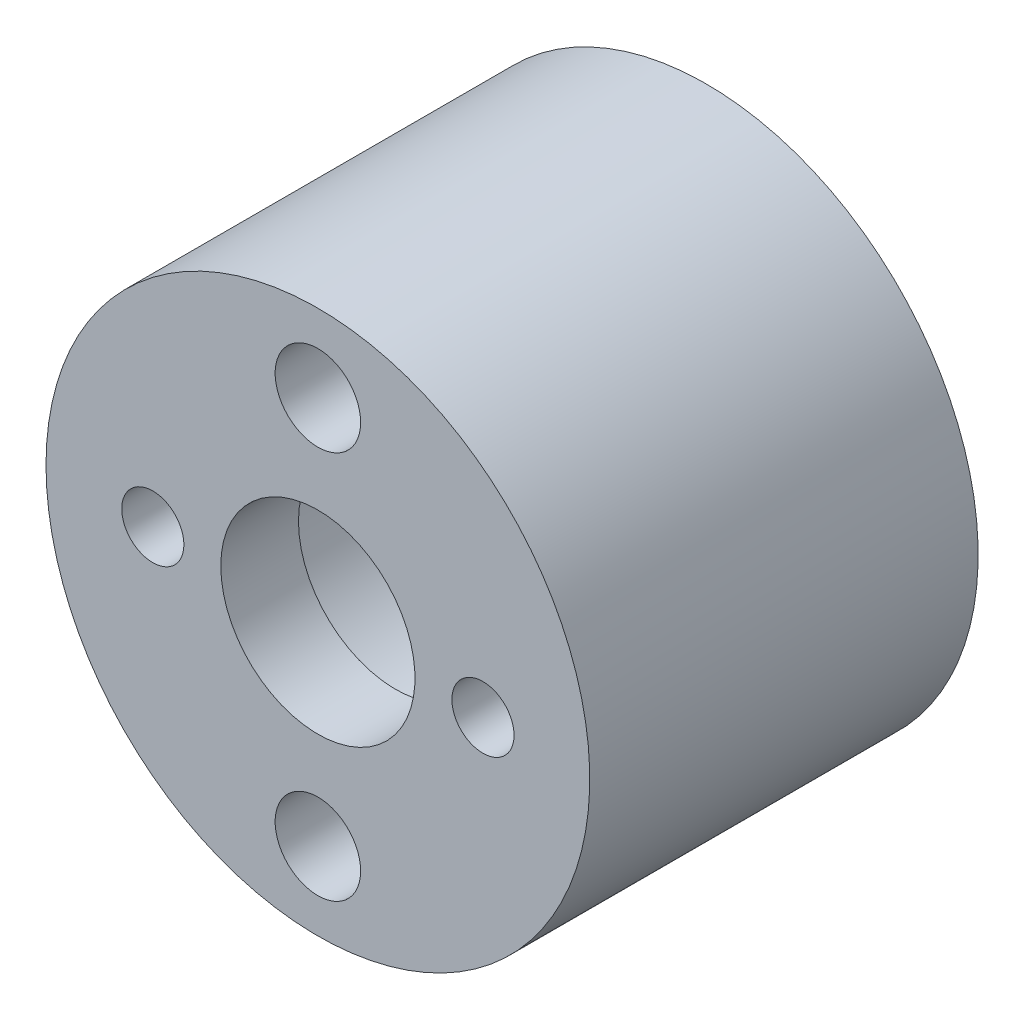
ISO-10303-21;
HEADER;
FILE_DESCRIPTION(('STEP AP214'),'2;1');
FILE_NAME('part.step','',(''),(''),'','','');
FILE_SCHEMA(('AUTOMOTIVE_DESIGN { 1 0 10303 214 1 1 1 1 }'));
ENDSEC;
DATA;
#1=APPLICATION_CONTEXT('core data for automotive mechanical design processes');
#2=APPLICATION_PROTOCOL_DEFINITION('international standard','automotive_design',2000,#1);
#3=PRODUCT_CONTEXT('',#1,'mechanical');
#4=PRODUCT('Part','Part','',(#3));
#5=PRODUCT_RELATED_PRODUCT_CATEGORY('part','',(#4));
#6=PRODUCT_DEFINITION_FORMATION('','',#4);
#7=PRODUCT_DEFINITION_CONTEXT('part definition',#1,'design');
#8=PRODUCT_DEFINITION('design','',#6,#7);
#9=PRODUCT_DEFINITION_SHAPE('','',#8);
#10=(LENGTH_UNIT() NAMED_UNIT(*) SI_UNIT(.MILLI.,.METRE.));
#11=(NAMED_UNIT(*) PLANE_ANGLE_UNIT() SI_UNIT($,.RADIAN.));
#12=(NAMED_UNIT(*) SI_UNIT($,.STERADIAN.) SOLID_ANGLE_UNIT());
#13=UNCERTAINTY_MEASURE_WITH_UNIT(LENGTH_MEASURE(1.E-05),#10,'distance_accuracy_value','');
#14=(GEOMETRIC_REPRESENTATION_CONTEXT(3) GLOBAL_UNCERTAINTY_ASSIGNED_CONTEXT((#13)) GLOBAL_UNIT_ASSIGNED_CONTEXT((#10,
#11,#12)) REPRESENTATION_CONTEXT('',''));
#15=CARTESIAN_POINT('',(0.,0.,0.));
#16=DIRECTION('',(0.,0.,1.));
#17=DIRECTION('',(1.,0.,0.));
#18=AXIS2_PLACEMENT_3D('',#15,#16,#17);
#19=CARTESIAN_POINT('',(0.,0.,0.));
#20=DIRECTION('',(0.,0.,-1.));
#21=DIRECTION('',(-1.,0.,0.));
#22=AXIS2_PLACEMENT_3D('',#19,#20,#21);
#23=PLANE('',#22);
#24=CARTESIAN_POINT('',(-4.25,0.,0.));
#25=DIRECTION('',(0.,0.,1.));
#26=DIRECTION('',(1.,0.,0.));
#27=AXIS2_PLACEMENT_3D('',#24,#25,#26);
#28=CIRCLE('',#27,0.8);
#29=CARTESIAN_POINT('',(-3.45,0.,0.));
#30=VERTEX_POINT('',#29);
#31=EDGE_CURVE('E74',#30,#30,#28,.T.);
#32=ORIENTED_EDGE('',*,*,#31,.F.);
#33=EDGE_LOOP('',(#32));
#34=FACE_BOUND('',#33,.T.);
#35=CARTESIAN_POINT('',(4.25,0.,0.));
#36=DIRECTION('',(0.,0.,1.));
#37=DIRECTION('',(1.,0.,0.));
#38=AXIS2_PLACEMENT_3D('',#35,#36,#37);
#39=CIRCLE('',#38,0.800000000000001);
#40=CARTESIAN_POINT('',(5.05,0.,0.));
#41=VERTEX_POINT('',#40);
#42=EDGE_CURVE('E73',#41,#41,#39,.T.);
#43=ORIENTED_EDGE('',*,*,#42,.F.);
#44=EDGE_LOOP('',(#43));
#45=FACE_BOUND('',#44,.T.);
#46=CARTESIAN_POINT('',(0.,-5.,0.));
#47=DIRECTION('',(0.,0.,1.));
#48=DIRECTION('',(1.,0.,0.));
#49=AXIS2_PLACEMENT_3D('',#46,#47,#48);
#50=CIRCLE('',#49,1.1);
#51=CARTESIAN_POINT('',(1.1,-5.,0.));
#52=VERTEX_POINT('',#51);
#53=EDGE_CURVE('E242',#52,#52,#50,.T.);
#54=ORIENTED_EDGE('',*,*,#53,.F.);
#55=EDGE_LOOP('',(#54));
#56=FACE_BOUND('',#55,.T.);
#57=CARTESIAN_POINT('',(0.,5.,0.));
#58=DIRECTION('',(0.,0.,1.));
#59=DIRECTION('',(1.,0.,0.));
#60=AXIS2_PLACEMENT_3D('',#57,#58,#59);
#61=CIRCLE('',#60,1.1);
#62=CARTESIAN_POINT('',(1.1,5.,0.));
#63=VERTEX_POINT('',#62);
#64=EDGE_CURVE('E250',#63,#63,#61,.T.);
#65=ORIENTED_EDGE('',*,*,#64,.F.);
#66=EDGE_LOOP('',(#65));
#67=FACE_BOUND('',#66,.T.);
#68=CARTESIAN_POINT('',(0.,0.,0.));
#69=DIRECTION('',(0.,0.,-1.));
#70=DIRECTION('',(-1.,0.,0.));
#71=AXIS2_PLACEMENT_3D('',#68,#69,#70);
#72=CIRCLE('',#71,2.5);
#73=CARTESIAN_POINT('',(-2.5,0.,0.));
#74=VERTEX_POINT('',#73);
#75=EDGE_CURVE('E255',#74,#74,#72,.T.);
#76=ORIENTED_EDGE('',*,*,#75,.T.);
#77=EDGE_LOOP('',(#76));
#78=FACE_BOUND('',#77,.T.);
#79=CARTESIAN_POINT('',(0.,0.,0.));
#80=DIRECTION('',(0.,0.,-1.));
#81=DIRECTION('',(-1.,0.,0.));
#82=AXIS2_PLACEMENT_3D('',#79,#80,#81);
#83=CIRCLE('',#82,7.);
#84=CARTESIAN_POINT('',(-7.,0.,0.));
#85=VERTEX_POINT('',#84);
#86=EDGE_CURVE('E67',#85,#85,#83,.T.);
#87=ORIENTED_EDGE('',*,*,#86,.F.);
#88=EDGE_LOOP('',(#87));
#89=FACE_BOUND('',#88,.T.);
#90=ADVANCED_FACE('F33',(#34,#45,#56,#67,#78,#89),#23,.F.);
#91=CARTESIAN_POINT('',(0.,0.,-2.));
#92=DIRECTION('',(0.,0.,-1.));
#93=DIRECTION('',(-1.,0.,0.));
#94=AXIS2_PLACEMENT_3D('',#91,#92,#93);
#95=CYLINDRICAL_SURFACE('',#94,7.);
#96=CARTESIAN_POINT('',(0.,0.,-10.));
#97=DIRECTION('',(0.,0.,-1.));
#98=DIRECTION('',(-1.,0.,0.));
#99=AXIS2_PLACEMENT_3D('',#96,#97,#98);
#100=CIRCLE('',#99,7.);
#101=CARTESIAN_POINT('',(-7.,0.,-10.));
#102=VERTEX_POINT('',#101);
#103=EDGE_CURVE('E87',#102,#102,#100,.T.);
#104=ORIENTED_EDGE('',*,*,#103,.F.);
#105=EDGE_LOOP('',(#104));
#106=FACE_BOUND('',#105,.T.);
#107=ORIENTED_EDGE('',*,*,#86,.T.);
#108=EDGE_LOOP('',(#107));
#109=FACE_BOUND('',#108,.T.);
#110=ADVANCED_FACE('F107',(#106,#109),#95,.T.);
#111=CARTESIAN_POINT('',(7.,0.,-10.));
#112=DIRECTION('',(0.,0.,1.));
#113=DIRECTION('',(1.,0.,0.));
#114=AXIS2_PLACEMENT_3D('',#111,#112,#113);
#115=PLANE('',#114);
#116=CARTESIAN_POINT('',(0.,0.,-10.));
#117=DIRECTION('',(0.,0.,1.));
#118=DIRECTION('',(1.,0.,0.));
#119=AXIS2_PLACEMENT_3D('',#116,#117,#118);
#120=CIRCLE('',#119,3.80000000000001);
#121=CARTESIAN_POINT('',(3.80000000000001,0.,-10.));
#122=VERTEX_POINT('',#121);
#123=EDGE_CURVE('E11',#122,#122,#120,.T.);
#124=ORIENTED_EDGE('',*,*,#123,.T.);
#125=EDGE_LOOP('',(#124));
#126=FACE_BOUND('',#125,.T.);
#127=ORIENTED_EDGE('',*,*,#103,.T.);
#128=EDGE_LOOP('',(#127));
#129=FACE_BOUND('',#128,.T.);
#130=ADVANCED_FACE('F112',(#126,#129),#115,.F.);
#131=CARTESIAN_POINT('',(0.,0.,-2.));
#132=DIRECTION('',(0.,0.,-1.));
#133=DIRECTION('',(-1.,0.,0.));
#134=AXIS2_PLACEMENT_3D('',#131,#132,#133);
#135=CYLINDRICAL_SURFACE('',#134,3.5);
#136=CARTESIAN_POINT('',(0.,0.,-9.7));
#137=DIRECTION('',(0.,0.,1.));
#138=DIRECTION('',(1.,0.,0.));
#139=AXIS2_PLACEMENT_3D('',#136,#137,#138);
#140=CIRCLE('',#139,3.5);
#141=CARTESIAN_POINT('',(3.5,0.,-9.7));
#142=VERTEX_POINT('',#141);
#143=EDGE_CURVE('E41',#142,#142,#140,.F.);
#144=ORIENTED_EDGE('',*,*,#143,.T.);
#145=EDGE_LOOP('',(#144));
#146=FACE_BOUND('',#145,.T.);
#147=CARTESIAN_POINT('',(0.,0.,-2.));
#148=DIRECTION('',(0.,0.,-1.));
#149=DIRECTION('',(-1.,0.,0.));
#150=AXIS2_PLACEMENT_3D('',#147,#148,#149);
#151=CIRCLE('',#150,3.5);
#152=CARTESIAN_POINT('',(3.49088235294118,0.25246860779883,-2.));
#153=VERTEX_POINT('',#152);
#154=CARTESIAN_POINT('',(3.49088235294118,-0.252468607798831,-2.));
#155=VERTEX_POINT('',#154);
#156=EDGE_CURVE('E86',#153,#155,#151,.T.);
#157=ORIENTED_EDGE('',*,*,#156,.F.);
#158=CARTESIAN_POINT('',(-3.49088235294118,0.252468607798824,-2.));
#159=VERTEX_POINT('',#158);
#160=EDGE_CURVE('E81',#159,#153,#151,.T.);
#161=ORIENTED_EDGE('',*,*,#160,.F.);
#162=CARTESIAN_POINT('',(-3.49088235294118,-0.252468607798824,-2.));
#163=VERTEX_POINT('',#162);
#164=EDGE_CURVE('E72',#163,#159,#151,.T.);
#165=ORIENTED_EDGE('',*,*,#164,.F.);
#166=EDGE_CURVE('E80',#155,#163,#151,.T.);
#167=ORIENTED_EDGE('',*,*,#166,.F.);
#168=EDGE_LOOP('',(#157,#161,#165,#167));
#169=FACE_BOUND('',#168,.T.);
#170=ADVANCED_FACE('F79',(#146,#169),#135,.F.);
#171=CARTESIAN_POINT('',(3.5,0.,-2.));
#172=DIRECTION('',(0.,0.,1.));
#173=DIRECTION('',(1.,0.,0.));
#174=AXIS2_PLACEMENT_3D('',#171,#172,#173);
#175=PLANE('',#174);
#176=CARTESIAN_POINT('',(0.,0.,-2.));
#177=DIRECTION('',(0.,0.,-1.));
#178=DIRECTION('',(-1.,0.,0.));
#179=AXIS2_PLACEMENT_3D('',#176,#177,#178);
#180=CIRCLE('',#179,2.5);
#181=CARTESIAN_POINT('',(-2.5,0.,-2.));
#182=VERTEX_POINT('',#181);
#183=EDGE_CURVE('E90',#182,#182,#180,.T.);
#184=ORIENTED_EDGE('',*,*,#183,.F.);
#185=EDGE_LOOP('',(#184));
#186=FACE_BOUND('',#185,.T.);
#187=ORIENTED_EDGE('',*,*,#166,.T.);
#188=CARTESIAN_POINT('',(-4.25,0.,-2.));
#189=DIRECTION('',(0.,0.,1.));
#190=DIRECTION('',(1.,0.,0.));
#191=AXIS2_PLACEMENT_3D('',#188,#189,#190);
#192=CIRCLE('',#191,0.8);
#193=EDGE_CURVE('E61',#163,#159,#192,.T.);
#194=ORIENTED_EDGE('',*,*,#193,.T.);
#195=ORIENTED_EDGE('',*,*,#160,.T.);
#196=CARTESIAN_POINT('',(4.25,0.,-2.));
#197=DIRECTION('',(0.,0.,1.));
#198=DIRECTION('',(1.,0.,0.));
#199=AXIS2_PLACEMENT_3D('',#196,#197,#198);
#200=CIRCLE('',#199,0.800000000000001);
#201=EDGE_CURVE('E85',#155,#153,#200,.F.);
#202=ORIENTED_EDGE('',*,*,#201,.F.);
#203=EDGE_LOOP('',(#187,#194,#195,#202));
#204=FACE_BOUND('',#203,.T.);
#205=ADVANCED_FACE('F84',(#186,#204),#175,.F.);
#206=CARTESIAN_POINT('',(0.,0.,0.));
#207=DIRECTION('',(0.,0.,-1.));
#208=DIRECTION('',(-1.,0.,0.));
#209=AXIS2_PLACEMENT_3D('',#206,#207,#208);
#210=CYLINDRICAL_SURFACE('',#209,2.5);
#211=ORIENTED_EDGE('',*,*,#75,.F.);
#212=EDGE_LOOP('',(#211));
#213=FACE_BOUND('',#212,.T.);
#214=ORIENTED_EDGE('',*,*,#183,.T.);
#215=EDGE_LOOP('',(#214));
#216=FACE_BOUND('',#215,.T.);
#217=ADVANCED_FACE('F125',(#213,#216),#210,.F.);
#218=CARTESIAN_POINT('',(0.,5.,-5.11126983722081));
#219=DIRECTION('',(0.,0.,1.));
#220=DIRECTION('',(1.,0.,0.));
#221=AXIS2_PLACEMENT_3D('',#218,#219,#220);
#222=CYLINDRICAL_SURFACE('',#221,1.1);
#223=CARTESIAN_POINT('',(0.,5.,-2.));
#224=DIRECTION('',(0.,0.,1.));
#225=DIRECTION('',(1.,0.,0.));
#226=AXIS2_PLACEMENT_3D('',#223,#224,#225);
#227=CIRCLE('',#226,1.1);
#228=CARTESIAN_POINT('',(1.1,5.,-2.));
#229=VERTEX_POINT('',#228);
#230=EDGE_CURVE('E253',#229,#229,#227,.F.);
#231=CARTESIAN_POINT('',(1.1,5.,-2.));
#232=CARTESIAN_POINT('',(1.1,5.,-1.97916666666667));
#233=CARTESIAN_POINT('',(1.1,5.,-1.95833333333333));
#234=CARTESIAN_POINT('',(1.1,5.,-1.91666666666667));
#235=CARTESIAN_POINT('',(1.1,5.,-1.89583333333333));
#236=CARTESIAN_POINT('',(1.1,5.,-1.85416666666667));
#237=CARTESIAN_POINT('',(1.1,5.,-1.83333333333333));
#238=CARTESIAN_POINT('',(1.1,5.,-1.79166666666667));
#239=CARTESIAN_POINT('',(1.1,5.,-1.77083333333333));
#240=CARTESIAN_POINT('',(1.1,5.,-1.72916666666667));
#241=CARTESIAN_POINT('',(1.1,5.,-1.70833333333333));
#242=CARTESIAN_POINT('',(1.1,5.,-1.66666666666667));
#243=CARTESIAN_POINT('',(1.1,5.,-1.64583333333333));
#244=CARTESIAN_POINT('',(1.1,5.,-1.60416666666667));
#245=CARTESIAN_POINT('',(1.1,5.,-1.58333333333333));
#246=CARTESIAN_POINT('',(1.1,5.,-1.54166666666667));
#247=CARTESIAN_POINT('',(1.1,5.,-1.52083333333333));
#248=CARTESIAN_POINT('',(1.1,5.,-1.47916666666667));
#249=CARTESIAN_POINT('',(1.1,5.,-1.45833333333333));
#250=CARTESIAN_POINT('',(1.1,5.,-1.41666666666667));
#251=CARTESIAN_POINT('',(1.1,5.,-1.39583333333333));
#252=CARTESIAN_POINT('',(1.1,5.,-1.35416666666667));
#253=CARTESIAN_POINT('',(1.1,5.,-1.33333333333333));
#254=CARTESIAN_POINT('',(1.1,5.,-1.29166666666667));
#255=CARTESIAN_POINT('',(1.1,5.,-1.27083333333333));
#256=CARTESIAN_POINT('',(1.1,5.,-1.22916666666667));
#257=CARTESIAN_POINT('',(1.1,5.,-1.20833333333333));
#258=CARTESIAN_POINT('',(1.1,5.,-1.16666666666667));
#259=CARTESIAN_POINT('',(1.1,5.,-1.14583333333333));
#260=CARTESIAN_POINT('',(1.1,5.,-1.10416666666667));
#261=CARTESIAN_POINT('',(1.1,5.,-1.08333333333333));
#262=CARTESIAN_POINT('',(1.1,5.,-1.04166666666667));
#263=CARTESIAN_POINT('',(1.1,5.,-1.02083333333333));
#264=CARTESIAN_POINT('',(1.1,5.,-0.979166666666668));
#265=CARTESIAN_POINT('',(1.1,5.,-0.958333333333334));
#266=CARTESIAN_POINT('',(1.1,5.,-0.916666666666668));
#267=CARTESIAN_POINT('',(1.1,5.,-0.895833333333334));
#268=CARTESIAN_POINT('',(1.1,5.,-0.854166666666667));
#269=CARTESIAN_POINT('',(1.1,5.,-0.833333333333334));
#270=CARTESIAN_POINT('',(1.1,5.,-0.791666666666667));
#271=CARTESIAN_POINT('',(1.1,5.,-0.770833333333334));
#272=CARTESIAN_POINT('',(1.1,5.,-0.729166666666667));
#273=CARTESIAN_POINT('',(1.1,5.,-0.708333333333334));
#274=CARTESIAN_POINT('',(1.1,5.,-0.666666666666668));
#275=CARTESIAN_POINT('',(1.1,5.,-0.645833333333334));
#276=CARTESIAN_POINT('',(1.1,5.,-0.604166666666668));
#277=CARTESIAN_POINT('',(1.1,5.,-0.583333333333335));
#278=CARTESIAN_POINT('',(1.1,5.,-0.541666666666668));
#279=CARTESIAN_POINT('',(1.1,5.,-0.520833333333335));
#280=CARTESIAN_POINT('',(1.1,5.,-0.479166666666668));
#281=CARTESIAN_POINT('',(1.1,5.,-0.458333333333335));
#282=CARTESIAN_POINT('',(1.1,5.,-0.416666666666668));
#283=CARTESIAN_POINT('',(1.1,5.,-0.395833333333335));
#284=CARTESIAN_POINT('',(1.1,5.,-0.354166666666668));
#285=CARTESIAN_POINT('',(1.1,5.,-0.333333333333335));
#286=CARTESIAN_POINT('',(1.1,5.,-0.291666666666668));
#287=CARTESIAN_POINT('',(1.1,5.,-0.270833333333334));
#288=CARTESIAN_POINT('',(1.1,5.,-0.229166666666668));
#289=CARTESIAN_POINT('',(1.1,5.,-0.208333333333334));
#290=CARTESIAN_POINT('',(1.1,5.,-0.166666666666668));
#291=CARTESIAN_POINT('',(1.1,5.,-0.145833333333334));
#292=CARTESIAN_POINT('',(1.1,5.,-0.104166666666668));
#293=CARTESIAN_POINT('',(1.1,5.,-0.0833333333333343));
#294=CARTESIAN_POINT('',(1.1,5.,-0.0416666666666676));
#295=CARTESIAN_POINT('',(1.1,5.,-0.0208333333333342));
#296=CARTESIAN_POINT('',(1.1,5.,0.));
#297=B_SPLINE_CURVE_WITH_KNOTS('',3,(#231,#232,#233,#234,#235,#236,#237,#238,#239,#240,#241,
#242,#243,#244,#245,#246,#247,#248,#249,#250,#251,#252,#253,#254,#255,#256,#257,#258,#259,#260,
#261,#262,#263,#264,#265,#266,#267,#268,#269,#270,#271,#272,#273,#274,#275,#276,#277,#278,#279,
#280,#281,#282,#283,#284,#285,#286,#287,#288,#289,#290,#291,#292,#293,#294,#295,#296),
.UNSPECIFIED.,.F.,.F.,(4,2,2,2,2,2,2,2,2,2,2,2,2,2,2,2,2,2,2,2,2,2,2,2,2,2,2,2,2,2,2,2,4),(0.,
0.0625000000000001,0.125,0.1875,0.25,0.3125,0.375,0.4375,0.5,0.5625,0.625,0.6875,0.75,
0.812499999999999,0.874999999999999,0.9375,1.,1.0625,1.125,1.1875,1.25,1.3125,1.375,1.4375,1.5,
1.5625,1.625,1.6875,1.75,1.8125,1.875,1.9375,2.),.UNSPECIFIED.);
#298=EDGE_CURVE('BSEAM129',#229,#63,#297,.T.);
#299=ORIENTED_EDGE('',*,*,#230,.T.);
#300=ORIENTED_EDGE('',*,*,#64,.T.);
#301=ORIENTED_EDGE('',*,*,#298,.T.);
#302=ORIENTED_EDGE('',*,*,#298,.F.);
#303=EDGE_LOOP('',(#299,#301,#300,#302));
#304=FACE_BOUND('',#303,.T.);
#305=ADVANCED_FACE('F129',(#304),#222,.F.);
#306=CARTESIAN_POINT('',(3.5,0.,-2.));
#307=DIRECTION('',(0.,0.,1.));
#308=DIRECTION('',(1.,0.,0.));
#309=AXIS2_PLACEMENT_3D('',#306,#307,#308);
#310=PLANE('',#309);
#311=ORIENTED_EDGE('',*,*,#230,.F.);
#312=EDGE_LOOP('',(#311));
#313=FACE_BOUND('',#312,.T.);
#314=ADVANCED_FACE('F133',(#313),#310,.T.);
#315=CARTESIAN_POINT('',(0.,-5.,-5.11126983722081));
#316=DIRECTION('',(0.,0.,1.));
#317=DIRECTION('',(1.,0.,0.));
#318=AXIS2_PLACEMENT_3D('',#315,#316,#317);
#319=CYLINDRICAL_SURFACE('',#318,1.1);
#320=CARTESIAN_POINT('',(0.,-5.,-2.));
#321=DIRECTION('',(0.,0.,1.));
#322=DIRECTION('',(1.,0.,0.));
#323=AXIS2_PLACEMENT_3D('',#320,#321,#322);
#324=CIRCLE('',#323,1.1);
#325=CARTESIAN_POINT('',(1.1,-5.,-2.));
#326=VERTEX_POINT('',#325);
#327=EDGE_CURVE('E244',#326,#326,#324,.F.);
#328=CARTESIAN_POINT('',(1.1,-5.,-2.));
#329=CARTESIAN_POINT('',(1.1,-5.,-1.97916666666667));
#330=CARTESIAN_POINT('',(1.1,-5.,-1.95833333333333));
#331=CARTESIAN_POINT('',(1.1,-5.,-1.91666666666667));
#332=CARTESIAN_POINT('',(1.1,-5.,-1.89583333333333));
#333=CARTESIAN_POINT('',(1.1,-5.,-1.85416666666667));
#334=CARTESIAN_POINT('',(1.1,-5.,-1.83333333333333));
#335=CARTESIAN_POINT('',(1.1,-5.,-1.79166666666667));
#336=CARTESIAN_POINT('',(1.1,-5.,-1.77083333333333));
#337=CARTESIAN_POINT('',(1.1,-5.,-1.72916666666667));
#338=CARTESIAN_POINT('',(1.1,-5.,-1.70833333333333));
#339=CARTESIAN_POINT('',(1.1,-5.,-1.66666666666667));
#340=CARTESIAN_POINT('',(1.1,-5.,-1.64583333333333));
#341=CARTESIAN_POINT('',(1.1,-5.,-1.60416666666667));
#342=CARTESIAN_POINT('',(1.1,-5.,-1.58333333333333));
#343=CARTESIAN_POINT('',(1.1,-5.,-1.54166666666667));
#344=CARTESIAN_POINT('',(1.1,-5.,-1.52083333333333));
#345=CARTESIAN_POINT('',(1.1,-5.,-1.47916666666667));
#346=CARTESIAN_POINT('',(1.1,-5.,-1.45833333333333));
#347=CARTESIAN_POINT('',(1.1,-5.,-1.41666666666667));
#348=CARTESIAN_POINT('',(1.1,-5.,-1.39583333333333));
#349=CARTESIAN_POINT('',(1.1,-5.,-1.35416666666667));
#350=CARTESIAN_POINT('',(1.1,-5.,-1.33333333333333));
#351=CARTESIAN_POINT('',(1.1,-5.,-1.29166666666667));
#352=CARTESIAN_POINT('',(1.1,-5.,-1.27083333333333));
#353=CARTESIAN_POINT('',(1.1,-5.,-1.22916666666667));
#354=CARTESIAN_POINT('',(1.1,-5.,-1.20833333333333));
#355=CARTESIAN_POINT('',(1.1,-5.,-1.16666666666667));
#356=CARTESIAN_POINT('',(1.1,-5.,-1.14583333333333));
#357=CARTESIAN_POINT('',(1.1,-5.,-1.10416666666667));
#358=CARTESIAN_POINT('',(1.1,-5.,-1.08333333333333));
#359=CARTESIAN_POINT('',(1.1,-5.,-1.04166666666667));
#360=CARTESIAN_POINT('',(1.1,-5.,-1.02083333333333));
#361=CARTESIAN_POINT('',(1.1,-5.,-0.979166666666668));
#362=CARTESIAN_POINT('',(1.1,-5.,-0.958333333333334));
#363=CARTESIAN_POINT('',(1.1,-5.,-0.916666666666668));
#364=CARTESIAN_POINT('',(1.1,-5.,-0.895833333333334));
#365=CARTESIAN_POINT('',(1.1,-5.,-0.854166666666667));
#366=CARTESIAN_POINT('',(1.1,-5.,-0.833333333333334));
#367=CARTESIAN_POINT('',(1.1,-5.,-0.791666666666667));
#368=CARTESIAN_POINT('',(1.1,-5.,-0.770833333333334));
#369=CARTESIAN_POINT('',(1.1,-5.,-0.729166666666667));
#370=CARTESIAN_POINT('',(1.1,-5.,-0.708333333333334));
#371=CARTESIAN_POINT('',(1.1,-5.,-0.666666666666668));
#372=CARTESIAN_POINT('',(1.1,-5.,-0.645833333333334));
#373=CARTESIAN_POINT('',(1.1,-5.,-0.604166666666668));
#374=CARTESIAN_POINT('',(1.1,-5.,-0.583333333333335));
#375=CARTESIAN_POINT('',(1.1,-5.,-0.541666666666668));
#376=CARTESIAN_POINT('',(1.1,-5.,-0.520833333333335));
#377=CARTESIAN_POINT('',(1.1,-5.,-0.479166666666668));
#378=CARTESIAN_POINT('',(1.1,-5.,-0.458333333333335));
#379=CARTESIAN_POINT('',(1.1,-5.,-0.416666666666668));
#380=CARTESIAN_POINT('',(1.1,-5.,-0.395833333333335));
#381=CARTESIAN_POINT('',(1.1,-5.,-0.354166666666668));
#382=CARTESIAN_POINT('',(1.1,-5.,-0.333333333333335));
#383=CARTESIAN_POINT('',(1.1,-5.,-0.291666666666668));
#384=CARTESIAN_POINT('',(1.1,-5.,-0.270833333333334));
#385=CARTESIAN_POINT('',(1.1,-5.,-0.229166666666668));
#386=CARTESIAN_POINT('',(1.1,-5.,-0.208333333333334));
#387=CARTESIAN_POINT('',(1.1,-5.,-0.166666666666668));
#388=CARTESIAN_POINT('',(1.1,-5.,-0.145833333333334));
#389=CARTESIAN_POINT('',(1.1,-5.,-0.104166666666668));
#390=CARTESIAN_POINT('',(1.1,-5.,-0.0833333333333343));
#391=CARTESIAN_POINT('',(1.1,-5.,-0.0416666666666676));
#392=CARTESIAN_POINT('',(1.1,-5.,-0.0208333333333342));
#393=CARTESIAN_POINT('',(1.1,-5.,0.));
#394=B_SPLINE_CURVE_WITH_KNOTS('',3,(#328,#329,#330,#331,#332,#333,#334,#335,#336,#337,#338,
#339,#340,#341,#342,#343,#344,#345,#346,#347,#348,#349,#350,#351,#352,#353,#354,#355,#356,#357,
#358,#359,#360,#361,#362,#363,#364,#365,#366,#367,#368,#369,#370,#371,#372,#373,#374,#375,#376,
#377,#378,#379,#380,#381,#382,#383,#384,#385,#386,#387,#388,#389,#390,#391,#392,#393),
.UNSPECIFIED.,.F.,.F.,(4,2,2,2,2,2,2,2,2,2,2,2,2,2,2,2,2,2,2,2,2,2,2,2,2,2,2,2,2,2,2,2,4),(0.,
0.0625000000000001,0.125,0.1875,0.25,0.3125,0.375,0.4375,0.5,0.5625,0.625,0.6875,0.75,
0.812499999999999,0.874999999999999,0.9375,1.,1.0625,1.125,1.1875,1.25,1.3125,1.375,1.4375,1.5,
1.5625,1.625,1.6875,1.75,1.8125,1.875,1.9375,2.),.UNSPECIFIED.);
#395=EDGE_CURVE('BSEAM137',#326,#52,#394,.T.);
#396=ORIENTED_EDGE('',*,*,#327,.T.);
#397=ORIENTED_EDGE('',*,*,#53,.T.);
#398=ORIENTED_EDGE('',*,*,#395,.T.);
#399=ORIENTED_EDGE('',*,*,#395,.F.);
#400=EDGE_LOOP('',(#396,#398,#397,#399));
#401=FACE_BOUND('',#400,.T.);
#402=ADVANCED_FACE('F137',(#401),#319,.F.);
#403=CARTESIAN_POINT('',(3.5,0.,-2.));
#404=DIRECTION('',(0.,0.,1.));
#405=DIRECTION('',(1.,0.,0.));
#406=AXIS2_PLACEMENT_3D('',#403,#404,#405);
#407=PLANE('',#406);
#408=ORIENTED_EDGE('',*,*,#327,.F.);
#409=EDGE_LOOP('',(#408));
#410=FACE_BOUND('',#409,.T.);
#411=ADVANCED_FACE('F141',(#410),#407,.T.);
#412=CARTESIAN_POINT('',(3.5,0.,-2.));
#413=DIRECTION('',(0.,0.,1.));
#414=DIRECTION('',(1.,0.,0.));
#415=AXIS2_PLACEMENT_3D('',#412,#413,#414);
#416=PLANE('',#415);
#417=ORIENTED_EDGE('',*,*,#156,.T.);
#418=EDGE_CURVE('E54',#153,#155,#200,.F.);
#419=ORIENTED_EDGE('',*,*,#418,.F.);
#420=EDGE_LOOP('',(#417,#419));
#421=FACE_BOUND('',#420,.T.);
#422=ADVANCED_FACE('F145',(#421),#416,.T.);
#423=CARTESIAN_POINT('',(4.25,0.,-5.11126983722081));
#424=DIRECTION('',(0.,0.,1.));
#425=DIRECTION('',(1.,0.,0.));
#426=AXIS2_PLACEMENT_3D('',#423,#424,#425);
#427=CYLINDRICAL_SURFACE('',#426,0.800000000000001);
#428=ORIENTED_EDGE('',*,*,#201,.T.);
#429=ORIENTED_EDGE('',*,*,#418,.T.);
#430=EDGE_LOOP('',(#428,#429));
#431=FACE_BOUND('',#430,.T.);
#432=ORIENTED_EDGE('',*,*,#42,.T.);
#433=EDGE_LOOP('',(#432));
#434=FACE_BOUND('',#433,.T.);
#435=ADVANCED_FACE('F147',(#431,#434),#427,.F.);
#436=CARTESIAN_POINT('',(3.5,0.,-2.));
#437=DIRECTION('',(0.,0.,1.));
#438=DIRECTION('',(1.,0.,0.));
#439=AXIS2_PLACEMENT_3D('',#436,#437,#438);
#440=PLANE('',#439);
#441=ORIENTED_EDGE('',*,*,#164,.T.);
#442=CARTESIAN_POINT('',(-4.25,0.,-2.));
#443=DIRECTION('',(0.,0.,1.));
#444=DIRECTION('',(1.,0.,0.));
#445=AXIS2_PLACEMENT_3D('',#442,#443,#444);
#446=CIRCLE('',#445,0.8);
#447=EDGE_CURVE('E47',#163,#159,#446,.F.);
#448=ORIENTED_EDGE('',*,*,#447,.F.);
#449=EDGE_LOOP('',(#441,#448));
#450=FACE_BOUND('',#449,.T.);
#451=ADVANCED_FACE('F71',(#450),#440,.T.);
#452=CARTESIAN_POINT('',(-4.25,0.,-5.11126983722081));
#453=DIRECTION('',(0.,0.,1.));
#454=DIRECTION('',(1.,0.,0.));
#455=AXIS2_PLACEMENT_3D('',#452,#453,#454);
#456=CYLINDRICAL_SURFACE('',#455,0.8);
#457=ORIENTED_EDGE('',*,*,#447,.T.);
#458=ORIENTED_EDGE('',*,*,#193,.F.);
#459=EDGE_LOOP('',(#457,#458));
#460=FACE_BOUND('',#459,.T.);
#461=ORIENTED_EDGE('',*,*,#31,.T.);
#462=EDGE_LOOP('',(#461));
#463=FACE_BOUND('',#462,.T.);
#464=ADVANCED_FACE('F62',(#460,#463),#456,.F.);
#465=CARTESIAN_POINT('',(0.,0.,-9.7));
#466=DIRECTION('',(0.,0.,-1.));
#467=DIRECTION('',(-1.,0.,0.));
#468=AXIS2_PLACEMENT_3D('',#465,#466,#467);
#469=CONICAL_SURFACE('',#468,3.5,0.785398163397457);
#470=ORIENTED_EDGE('',*,*,#123,.F.);
#471=EDGE_LOOP('',(#470));
#472=FACE_BOUND('',#471,.T.);
#473=ORIENTED_EDGE('',*,*,#143,.F.);
#474=EDGE_LOOP('',(#473));
#475=FACE_BOUND('',#474,.T.);
#476=ADVANCED_FACE('F35',(#472,#475),#469,.F.);
#477=CLOSED_SHELL('',(#90,#110,#130,#170,#205,#217,#305,#314,#402,#411,#422,#435,#451,#464,#476));
#478=MANIFOLD_SOLID_BREP('B2',#477);
#479=ADVANCED_BREP_SHAPE_REPRESENTATION('',(#18,#478),#14);
#480=SHAPE_DEFINITION_REPRESENTATION(#9,#479);
ENDSEC;
END-ISO-10303-21;
